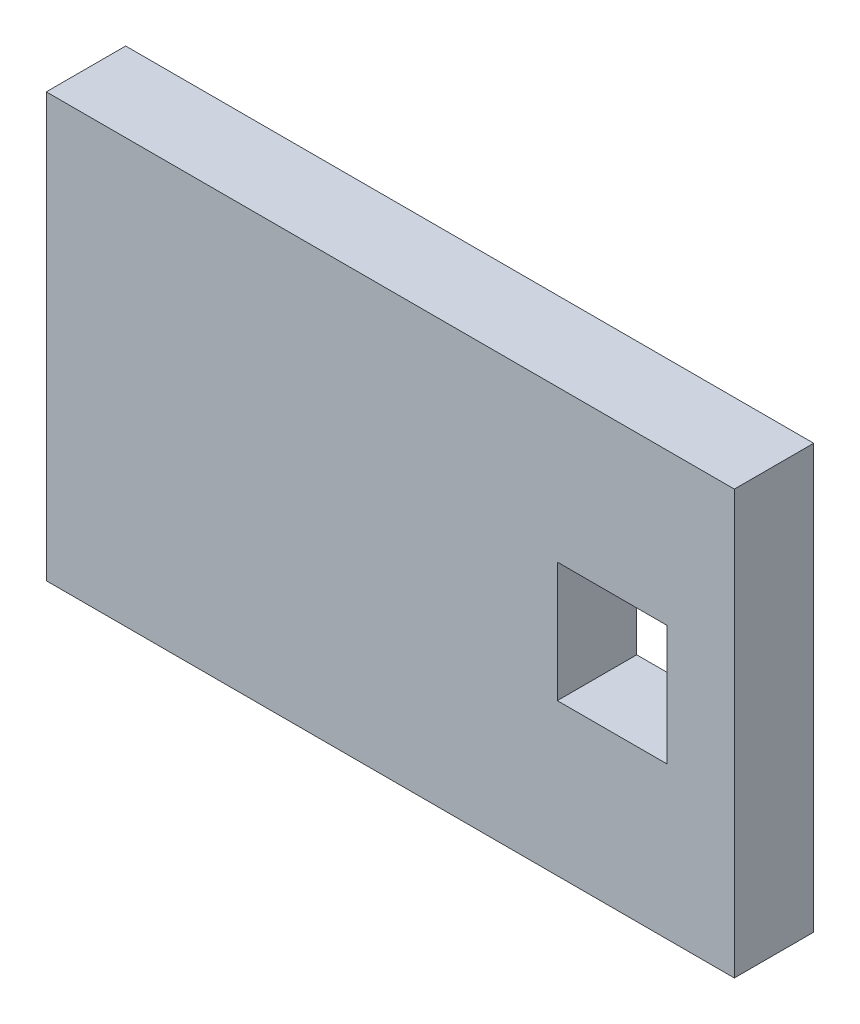
ISO-10303-21;
HEADER;
FILE_DESCRIPTION(('STEP AP214'),'2;1');
FILE_NAME('part.step','',(''),(''),'','','');
FILE_SCHEMA(('AUTOMOTIVE_DESIGN { 1 0 10303 214 1 1 1 1 }'));
ENDSEC;
DATA;
#1=APPLICATION_CONTEXT('core data for automotive mechanical design processes');
#2=APPLICATION_PROTOCOL_DEFINITION('international standard','automotive_design',2000,#1);
#3=PRODUCT_CONTEXT('',#1,'mechanical');
#4=PRODUCT('Part','Part','',(#3));
#5=PRODUCT_RELATED_PRODUCT_CATEGORY('part','',(#4));
#6=PRODUCT_DEFINITION_FORMATION('','',#4);
#7=PRODUCT_DEFINITION_CONTEXT('part definition',#1,'design');
#8=PRODUCT_DEFINITION('design','',#6,#7);
#9=PRODUCT_DEFINITION_SHAPE('','',#8);
#10=(LENGTH_UNIT() NAMED_UNIT(*) SI_UNIT(.MILLI.,.METRE.));
#11=(NAMED_UNIT(*) PLANE_ANGLE_UNIT() SI_UNIT($,.RADIAN.));
#12=(NAMED_UNIT(*) SI_UNIT($,.STERADIAN.) SOLID_ANGLE_UNIT());
#13=UNCERTAINTY_MEASURE_WITH_UNIT(LENGTH_MEASURE(1.E-05),#10,'distance_accuracy_value','');
#14=(GEOMETRIC_REPRESENTATION_CONTEXT(3) GLOBAL_UNCERTAINTY_ASSIGNED_CONTEXT((#13)) GLOBAL_UNIT_ASSIGNED_CONTEXT((#10,
#11,#12)) REPRESENTATION_CONTEXT('',''));
#15=CARTESIAN_POINT('',(0.,0.,0.));
#16=DIRECTION('',(0.,0.,1.));
#17=DIRECTION('',(1.,0.,0.));
#18=AXIS2_PLACEMENT_3D('',#15,#16,#17);
#19=CARTESIAN_POINT('',(0.,0.,3.));
#20=DIRECTION('',(0.,0.,-1.));
#21=DIRECTION('',(-1.,0.,0.));
#22=AXIS2_PLACEMENT_3D('',#19,#20,#21);
#23=PLANE('',#22);
#24=DIRECTION('',(-1.,0.,0.));
#25=VECTOR('',#24,1.);
#26=CARTESIAN_POINT('',(6.31160833904687,2.26758397182891,3.));
#27=LINE('',#26,#25);
#28=CARTESIAN_POINT('',(10.4594224934544,2.26758397182891,3.));
#29=VERTEX_POINT('',#28);
#30=CARTESIAN_POINT('',(6.31160833904687,2.26758397182891,3.));
#31=VERTEX_POINT('',#30);
#32=EDGE_CURVE('E109',#29,#31,#27,.T.);
#33=ORIENTED_EDGE('',*,*,#32,.F.);
#34=DIRECTION('',(0.,1.,0.));
#35=VECTOR('',#34,1.);
#36=CARTESIAN_POINT('',(10.4594224934544,-2.26758397182891,3.));
#37=LINE('',#36,#35);
#38=CARTESIAN_POINT('',(10.4594224934544,-2.26758397182891,3.));
#39=VERTEX_POINT('',#38);
#40=EDGE_CURVE('E48',#39,#29,#37,.T.);
#41=ORIENTED_EDGE('',*,*,#40,.F.);
#42=DIRECTION('',(1.,0.,0.));
#43=VECTOR('',#42,1.);
#44=CARTESIAN_POINT('',(6.31160833904687,-2.26758397182891,3.));
#45=LINE('',#44,#43);
#46=CARTESIAN_POINT('',(6.31160833904687,-2.26758397182891,3.));
#47=VERTEX_POINT('',#46);
#48=EDGE_CURVE('E115',#47,#39,#45,.T.);
#49=ORIENTED_EDGE('',*,*,#48,.F.);
#50=DIRECTION('',(0.,-1.,0.));
#51=VECTOR('',#50,1.);
#52=CARTESIAN_POINT('',(6.31160833904687,-2.26758397182891,3.));
#53=LINE('',#52,#51);
#54=EDGE_CURVE('E100',#31,#47,#53,.T.);
#55=ORIENTED_EDGE('',*,*,#54,.F.);
#56=EDGE_LOOP('',(#33,#41,#49,#55));
#57=FACE_BOUND('',#56,.T.);
#58=DIRECTION('',(0.,1.,0.));
#59=VECTOR('',#58,1.);
#60=CARTESIAN_POINT('',(13.,-8.,3.));
#61=LINE('',#60,#59);
#62=CARTESIAN_POINT('',(13.,-8.,3.));
#63=VERTEX_POINT('',#62);
#64=CARTESIAN_POINT('',(13.,8.,3.));
#65=VERTEX_POINT('',#64);
#66=EDGE_CURVE('E125',#63,#65,#61,.T.);
#67=ORIENTED_EDGE('',*,*,#66,.T.);
#68=DIRECTION('',(-1.,0.,0.));
#69=VECTOR('',#68,1.);
#70=CARTESIAN_POINT('',(-13.,8.,3.));
#71=LINE('',#70,#69);
#72=CARTESIAN_POINT('',(-13.,8.,3.));
#73=VERTEX_POINT('',#72);
#74=EDGE_CURVE('E128',#65,#73,#71,.T.);
#75=ORIENTED_EDGE('',*,*,#74,.T.);
#76=DIRECTION('',(0.,-1.,0.));
#77=VECTOR('',#76,1.);
#78=CARTESIAN_POINT('',(-13.,-8.,3.));
#79=LINE('',#78,#77);
#80=CARTESIAN_POINT('',(-13.,-8.,3.));
#81=VERTEX_POINT('',#80);
#82=EDGE_CURVE('E131',#73,#81,#79,.T.);
#83=ORIENTED_EDGE('',*,*,#82,.T.);
#84=DIRECTION('',(1.,0.,0.));
#85=VECTOR('',#84,1.);
#86=CARTESIAN_POINT('',(-13.,-8.,3.));
#87=LINE('',#86,#85);
#88=EDGE_CURVE('E133',#81,#63,#87,.T.);
#89=ORIENTED_EDGE('',*,*,#88,.T.);
#90=EDGE_LOOP('',(#67,#75,#83,#89));
#91=FACE_BOUND('',#90,.T.);
#92=ADVANCED_FACE('F33',(#57,#91),#23,.F.);
#93=CARTESIAN_POINT('',(0.,0.,0.));
#94=DIRECTION('',(0.,0.,-1.));
#95=DIRECTION('',(-1.,0.,0.));
#96=AXIS2_PLACEMENT_3D('',#93,#94,#95);
#97=PLANE('',#96);
#98=DIRECTION('',(0.,-1.,0.));
#99=VECTOR('',#98,1.);
#100=CARTESIAN_POINT('',(10.4594224934544,0.,0.));
#101=LINE('',#100,#99);
#102=CARTESIAN_POINT('',(10.4594224934544,2.26758397182891,0.));
#103=VERTEX_POINT('',#102);
#104=CARTESIAN_POINT('',(10.4594224934544,-2.26758397182891,0.));
#105=VERTEX_POINT('',#104);
#106=EDGE_CURVE('E11',#103,#105,#101,.T.);
#107=ORIENTED_EDGE('',*,*,#106,.F.);
#108=DIRECTION('',(1.,0.,0.));
#109=VECTOR('',#108,1.);
#110=CARTESIAN_POINT('',(0.,2.26758397182891,0.));
#111=LINE('',#110,#109);
#112=CARTESIAN_POINT('',(6.31160833904687,2.26758397182891,0.));
#113=VERTEX_POINT('',#112);
#114=EDGE_CURVE('E154',#113,#103,#111,.T.);
#115=ORIENTED_EDGE('',*,*,#114,.F.);
#116=DIRECTION('',(0.,1.,0.));
#117=VECTOR('',#116,1.);
#118=CARTESIAN_POINT('',(6.31160833904687,0.,0.));
#119=LINE('',#118,#117);
#120=CARTESIAN_POINT('',(6.31160833904687,-2.26758397182891,0.));
#121=VERTEX_POINT('',#120);
#122=EDGE_CURVE('E103',#121,#113,#119,.T.);
#123=ORIENTED_EDGE('',*,*,#122,.F.);
#124=DIRECTION('',(-1.,0.,0.));
#125=VECTOR('',#124,1.);
#126=CARTESIAN_POINT('',(0.,-2.26758397182891,0.));
#127=LINE('',#126,#125);
#128=EDGE_CURVE('E41',#105,#121,#127,.T.);
#129=ORIENTED_EDGE('',*,*,#128,.F.);
#130=EDGE_LOOP('',(#107,#115,#123,#129));
#131=FACE_BOUND('',#130,.T.);
#132=DIRECTION('',(0.,1.,0.));
#133=VECTOR('',#132,1.);
#134=CARTESIAN_POINT('',(13.,-8.,0.));
#135=LINE('',#134,#133);
#136=CARTESIAN_POINT('',(13.,-8.,0.));
#137=VERTEX_POINT('',#136);
#138=CARTESIAN_POINT('',(13.,8.,0.));
#139=VERTEX_POINT('',#138);
#140=EDGE_CURVE('E122',#137,#139,#135,.T.);
#141=ORIENTED_EDGE('',*,*,#140,.F.);
#142=DIRECTION('',(1.,0.,0.));
#143=VECTOR('',#142,1.);
#144=CARTESIAN_POINT('',(-13.,-8.,0.));
#145=LINE('',#144,#143);
#146=CARTESIAN_POINT('',(-13.,-8.,0.));
#147=VERTEX_POINT('',#146);
#148=EDGE_CURVE('E129',#147,#137,#145,.T.);
#149=ORIENTED_EDGE('',*,*,#148,.F.);
#150=DIRECTION('',(0.,-1.,0.));
#151=VECTOR('',#150,1.);
#152=CARTESIAN_POINT('',(-13.,-8.,0.));
#153=LINE('',#152,#151);
#154=CARTESIAN_POINT('',(-13.,8.,0.));
#155=VERTEX_POINT('',#154);
#156=EDGE_CURVE('E140',#155,#147,#153,.T.);
#157=ORIENTED_EDGE('',*,*,#156,.F.);
#158=DIRECTION('',(-1.,0.,0.));
#159=VECTOR('',#158,1.);
#160=CARTESIAN_POINT('',(-13.,8.,0.));
#161=LINE('',#160,#159);
#162=EDGE_CURVE('E138',#139,#155,#161,.T.);
#163=ORIENTED_EDGE('',*,*,#162,.F.);
#164=EDGE_LOOP('',(#141,#149,#157,#163));
#165=FACE_BOUND('',#164,.T.);
#166=ADVANCED_FACE('F162',(#131,#165),#97,.T.);
#167=CARTESIAN_POINT('',(13.,-8.,3.));
#168=DIRECTION('',(-1.,0.,0.));
#169=DIRECTION('',(0.,0.,1.));
#170=AXIS2_PLACEMENT_3D('',#167,#168,#169);
#171=PLANE('',#170);
#172=ORIENTED_EDGE('',*,*,#140,.T.);
#173=DIRECTION('',(0.,0.,-1.));
#174=VECTOR('',#173,1.);
#175=CARTESIAN_POINT('',(13.,8.,3.));
#176=LINE('',#175,#174);
#177=EDGE_CURVE('E151',#65,#139,#176,.T.);
#178=ORIENTED_EDGE('',*,*,#177,.F.);
#179=ORIENTED_EDGE('',*,*,#66,.F.);
#180=DIRECTION('',(0.,0.,-1.));
#181=VECTOR('',#180,1.);
#182=CARTESIAN_POINT('',(13.,-8.,3.));
#183=LINE('',#182,#181);
#184=EDGE_CURVE('E135',#63,#137,#183,.T.);
#185=ORIENTED_EDGE('',*,*,#184,.T.);
#186=EDGE_LOOP('',(#172,#178,#179,#185));
#187=FACE_BOUND('',#186,.T.);
#188=ADVANCED_FACE('F35',(#187),#171,.F.);
#189=CARTESIAN_POINT('',(-13.,8.,3.));
#190=DIRECTION('',(0.,-1.,0.));
#191=DIRECTION('',(0.,0.,-1.));
#192=AXIS2_PLACEMENT_3D('',#189,#190,#191);
#193=PLANE('',#192);
#194=ORIENTED_EDGE('',*,*,#162,.T.);
#195=DIRECTION('',(0.,0.,-1.));
#196=VECTOR('',#195,1.);
#197=CARTESIAN_POINT('',(-13.,8.,3.));
#198=LINE('',#197,#196);
#199=EDGE_CURVE('E148',#73,#155,#198,.T.);
#200=ORIENTED_EDGE('',*,*,#199,.F.);
#201=ORIENTED_EDGE('',*,*,#74,.F.);
#202=ORIENTED_EDGE('',*,*,#177,.T.);
#203=EDGE_LOOP('',(#194,#200,#201,#202));
#204=FACE_BOUND('',#203,.T.);
#205=ADVANCED_FACE('F186',(#204),#193,.F.);
#206=CARTESIAN_POINT('',(-13.,-8.,3.));
#207=DIRECTION('',(1.,0.,0.));
#208=DIRECTION('',(0.,0.,-1.));
#209=AXIS2_PLACEMENT_3D('',#206,#207,#208);
#210=PLANE('',#209);
#211=ORIENTED_EDGE('',*,*,#156,.T.);
#212=DIRECTION('',(0.,0.,-1.));
#213=VECTOR('',#212,1.);
#214=CARTESIAN_POINT('',(-13.,-8.,3.));
#215=LINE('',#214,#213);
#216=EDGE_CURVE('E145',#81,#147,#215,.T.);
#217=ORIENTED_EDGE('',*,*,#216,.F.);
#218=ORIENTED_EDGE('',*,*,#82,.F.);
#219=ORIENTED_EDGE('',*,*,#199,.T.);
#220=EDGE_LOOP('',(#211,#217,#218,#219));
#221=FACE_BOUND('',#220,.T.);
#222=ADVANCED_FACE('F173',(#221),#210,.F.);
#223=CARTESIAN_POINT('',(-13.,-8.,3.));
#224=DIRECTION('',(0.,1.,0.));
#225=DIRECTION('',(0.,0.,1.));
#226=AXIS2_PLACEMENT_3D('',#223,#224,#225);
#227=PLANE('',#226);
#228=ORIENTED_EDGE('',*,*,#148,.T.);
#229=ORIENTED_EDGE('',*,*,#184,.F.);
#230=ORIENTED_EDGE('',*,*,#88,.F.);
#231=ORIENTED_EDGE('',*,*,#216,.T.);
#232=EDGE_LOOP('',(#228,#229,#230,#231));
#233=FACE_BOUND('',#232,.T.);
#234=ADVANCED_FACE('F166',(#233),#227,.F.);
#235=CARTESIAN_POINT('',(10.4594224934544,-2.26758397182891,-7.));
#236=DIRECTION('',(1.,0.,0.));
#237=DIRECTION('',(0.,0.,-1.));
#238=AXIS2_PLACEMENT_3D('',#235,#236,#237);
#239=PLANE('',#238);
#240=ORIENTED_EDGE('',*,*,#106,.T.);
#241=DIRECTION('',(0.,0.,1.));
#242=VECTOR('',#241,1.);
#243=CARTESIAN_POINT('',(10.4594224934544,-2.26758397182891,-7.));
#244=LINE('',#243,#242);
#245=EDGE_CURVE('E120',#105,#39,#244,.T.);
#246=ORIENTED_EDGE('',*,*,#245,.T.);
#247=ORIENTED_EDGE('',*,*,#40,.T.);
#248=DIRECTION('',(0.,0.,1.));
#249=VECTOR('',#248,1.);
#250=CARTESIAN_POINT('',(10.4594224934544,2.26758397182891,-7.));
#251=LINE('',#250,#249);
#252=EDGE_CURVE('E106',#103,#29,#251,.T.);
#253=ORIENTED_EDGE('',*,*,#252,.F.);
#254=EDGE_LOOP('',(#240,#246,#247,#253));
#255=FACE_BOUND('',#254,.T.);
#256=ADVANCED_FACE('F164',(#255),#239,.F.);
#257=CARTESIAN_POINT('',(6.31160833904687,-2.26758397182891,-7.));
#258=DIRECTION('',(0.,-1.,0.));
#259=DIRECTION('',(0.,0.,-1.));
#260=AXIS2_PLACEMENT_3D('',#257,#258,#259);
#261=PLANE('',#260);
#262=ORIENTED_EDGE('',*,*,#128,.T.);
#263=DIRECTION('',(0.,0.,1.));
#264=VECTOR('',#263,1.);
#265=CARTESIAN_POINT('',(6.31160833904687,-2.26758397182891,-7.));
#266=LINE('',#265,#264);
#267=EDGE_CURVE('E105',#121,#47,#266,.T.);
#268=ORIENTED_EDGE('',*,*,#267,.T.);
#269=ORIENTED_EDGE('',*,*,#48,.T.);
#270=ORIENTED_EDGE('',*,*,#245,.F.);
#271=EDGE_LOOP('',(#262,#268,#269,#270));
#272=FACE_BOUND('',#271,.T.);
#273=ADVANCED_FACE('F159',(#272),#261,.F.);
#274=CARTESIAN_POINT('',(6.31160833904687,-2.26758397182891,-7.));
#275=DIRECTION('',(-1.,0.,0.));
#276=DIRECTION('',(0.,0.,1.));
#277=AXIS2_PLACEMENT_3D('',#274,#275,#276);
#278=PLANE('',#277);
#279=ORIENTED_EDGE('',*,*,#122,.T.);
#280=DIRECTION('',(0.,0.,1.));
#281=VECTOR('',#280,1.);
#282=CARTESIAN_POINT('',(6.31160833904687,2.26758397182891,-7.));
#283=LINE('',#282,#281);
#284=EDGE_CURVE('E56',#113,#31,#283,.T.);
#285=ORIENTED_EDGE('',*,*,#284,.T.);
#286=ORIENTED_EDGE('',*,*,#54,.T.);
#287=ORIENTED_EDGE('',*,*,#267,.F.);
#288=EDGE_LOOP('',(#279,#285,#286,#287));
#289=FACE_BOUND('',#288,.T.);
#290=ADVANCED_FACE('F97',(#289),#278,.F.);
#291=CARTESIAN_POINT('',(6.31160833904687,2.26758397182891,-7.));
#292=DIRECTION('',(0.,1.,0.));
#293=DIRECTION('',(0.,0.,1.));
#294=AXIS2_PLACEMENT_3D('',#291,#292,#293);
#295=PLANE('',#294);
#296=ORIENTED_EDGE('',*,*,#114,.T.);
#297=ORIENTED_EDGE('',*,*,#252,.T.);
#298=ORIENTED_EDGE('',*,*,#32,.T.);
#299=ORIENTED_EDGE('',*,*,#284,.F.);
#300=EDGE_LOOP('',(#296,#297,#298,#299));
#301=FACE_BOUND('',#300,.T.);
#302=ADVANCED_FACE('F110',(#301),#295,.F.);
#303=CLOSED_SHELL('',(#92,#166,#188,#205,#222,#234,#256,#273,#290,#302));
#304=MANIFOLD_SOLID_BREP('B2',#303);
#305=ADVANCED_BREP_SHAPE_REPRESENTATION('',(#18,#304),#14);
#306=SHAPE_DEFINITION_REPRESENTATION(#9,#305);
ENDSEC;
END-ISO-10303-21;
